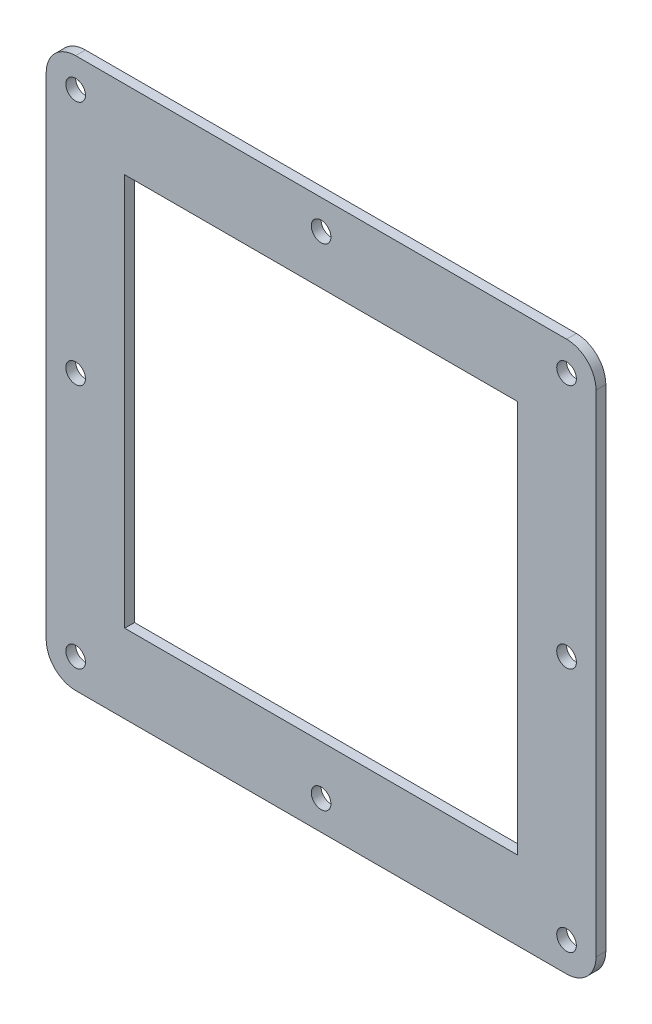
ISO-10303-21;
HEADER;
FILE_DESCRIPTION(('STEP AP214'),'2;1');
FILE_NAME('part.step','',(''),(''),'','','');
FILE_SCHEMA(('AUTOMOTIVE_DESIGN { 1 0 10303 214 1 1 1 1 }'));
ENDSEC;
DATA;
#1=APPLICATION_CONTEXT('core data for automotive mechanical design processes');
#2=APPLICATION_PROTOCOL_DEFINITION('international standard','automotive_design',2000,#1);
#3=PRODUCT_CONTEXT('',#1,'mechanical');
#4=PRODUCT('Part','Part','',(#3));
#5=PRODUCT_RELATED_PRODUCT_CATEGORY('part','',(#4));
#6=PRODUCT_DEFINITION_FORMATION('','',#4);
#7=PRODUCT_DEFINITION_CONTEXT('part definition',#1,'design');
#8=PRODUCT_DEFINITION('design','',#6,#7);
#9=PRODUCT_DEFINITION_SHAPE('','',#8);
#10=(LENGTH_UNIT() NAMED_UNIT(*) SI_UNIT(.MILLI.,.METRE.));
#11=(NAMED_UNIT(*) PLANE_ANGLE_UNIT() SI_UNIT($,.RADIAN.));
#12=(NAMED_UNIT(*) SI_UNIT($,.STERADIAN.) SOLID_ANGLE_UNIT());
#13=UNCERTAINTY_MEASURE_WITH_UNIT(LENGTH_MEASURE(1.E-05),#10,'distance_accuracy_value','');
#14=(GEOMETRIC_REPRESENTATION_CONTEXT(3) GLOBAL_UNCERTAINTY_ASSIGNED_CONTEXT((#13)) GLOBAL_UNIT_ASSIGNED_CONTEXT((#10,
#11,#12)) REPRESENTATION_CONTEXT('',''));
#15=CARTESIAN_POINT('',(0.,0.,0.));
#16=DIRECTION('',(0.,0.,1.));
#17=DIRECTION('',(1.,0.,0.));
#18=AXIS2_PLACEMENT_3D('',#15,#16,#17);
#19=CARTESIAN_POINT('',(-125.,-125.,5.));
#20=DIRECTION('',(0.,0.,1.));
#21=DIRECTION('',(1.,0.,0.));
#22=AXIS2_PLACEMENT_3D('',#19,#20,#21);
#23=PLANE('',#22);
#24=DIRECTION('',(0.,1.,0.));
#25=VECTOR('',#24,1.);
#26=CARTESIAN_POINT('',(100.,100.,5.));
#27=LINE('',#26,#25);
#28=CARTESIAN_POINT('',(100.,-100.,5.));
#29=VERTEX_POINT('',#28);
#30=CARTESIAN_POINT('',(100.,100.,5.));
#31=VERTEX_POINT('',#30);
#32=EDGE_CURVE('E48',#29,#31,#27,.T.);
#33=ORIENTED_EDGE('',*,*,#32,.F.);
#34=DIRECTION('',(1.,0.,0.));
#35=VECTOR('',#34,1.);
#36=CARTESIAN_POINT('',(-100.,-100.,5.));
#37=LINE('',#36,#35);
#38=CARTESIAN_POINT('',(-100.,-100.,5.));
#39=VERTEX_POINT('',#38);
#40=EDGE_CURVE('E140',#39,#29,#37,.T.);
#41=ORIENTED_EDGE('',*,*,#40,.F.);
#42=DIRECTION('',(0.,-1.,0.));
#43=VECTOR('',#42,1.);
#44=CARTESIAN_POINT('',(-100.,100.,5.));
#45=LINE('',#44,#43);
#46=CARTESIAN_POINT('',(-100.,100.,5.));
#47=VERTEX_POINT('',#46);
#48=EDGE_CURVE('E125',#47,#39,#45,.T.);
#49=ORIENTED_EDGE('',*,*,#48,.F.);
#50=DIRECTION('',(-1.,0.,0.));
#51=VECTOR('',#50,1.);
#52=CARTESIAN_POINT('',(-100.,100.,5.));
#53=LINE('',#52,#51);
#54=EDGE_CURVE('E134',#31,#47,#53,.T.);
#55=ORIENTED_EDGE('',*,*,#54,.F.);
#56=EDGE_LOOP('',(#33,#41,#49,#55));
#57=FACE_BOUND('',#56,.T.);
#58=CARTESIAN_POINT('',(0.,-125.,5.));
#59=DIRECTION('',(0.,0.,1.));
#60=DIRECTION('',(1.,0.,0.));
#61=AXIS2_PLACEMENT_3D('',#58,#59,#60);
#62=CIRCLE('',#61,5.);
#63=CARTESIAN_POINT('',(5.,-125.,5.));
#64=VERTEX_POINT('',#63);
#65=EDGE_CURVE('E156',#64,#64,#62,.T.);
#66=ORIENTED_EDGE('',*,*,#65,.F.);
#67=EDGE_LOOP('',(#66));
#68=FACE_BOUND('',#67,.T.);
#69=CARTESIAN_POINT('',(125.,0.,5.));
#70=DIRECTION('',(0.,0.,1.));
#71=DIRECTION('',(1.,0.,0.));
#72=AXIS2_PLACEMENT_3D('',#69,#70,#71);
#73=CIRCLE('',#72,5.00000000000001);
#74=CARTESIAN_POINT('',(130.,0.,5.));
#75=VERTEX_POINT('',#74);
#76=EDGE_CURVE('E174',#75,#75,#73,.T.);
#77=ORIENTED_EDGE('',*,*,#76,.F.);
#78=EDGE_LOOP('',(#77));
#79=FACE_BOUND('',#78,.T.);
#80=CARTESIAN_POINT('',(0.,125.,5.));
#81=DIRECTION('',(0.,0.,1.));
#82=DIRECTION('',(1.,0.,0.));
#83=AXIS2_PLACEMENT_3D('',#80,#81,#82);
#84=CIRCLE('',#83,5.);
#85=CARTESIAN_POINT('',(4.99999999999999,125.,5.));
#86=VERTEX_POINT('',#85);
#87=EDGE_CURVE('E186',#86,#86,#84,.T.);
#88=ORIENTED_EDGE('',*,*,#87,.F.);
#89=EDGE_LOOP('',(#88));
#90=FACE_BOUND('',#89,.T.);
#91=CARTESIAN_POINT('',(-125.,-125.,5.));
#92=DIRECTION('',(0.,0.,1.));
#93=DIRECTION('',(1.,0.,0.));
#94=AXIS2_PLACEMENT_3D('',#91,#92,#93);
#95=CIRCLE('',#94,15.);
#96=CARTESIAN_POINT('',(-140.,-125.,5.));
#97=VERTEX_POINT('',#96);
#98=CARTESIAN_POINT('',(-125.,-140.,5.));
#99=VERTEX_POINT('',#98);
#100=EDGE_CURVE('E198',#97,#99,#95,.T.);
#101=ORIENTED_EDGE('',*,*,#100,.T.);
#102=DIRECTION('',(1.,0.,0.));
#103=VECTOR('',#102,1.);
#104=CARTESIAN_POINT('',(-125.,-140.,5.));
#105=LINE('',#104,#103);
#106=CARTESIAN_POINT('',(125.,-140.,5.));
#107=VERTEX_POINT('',#106);
#108=EDGE_CURVE('E201',#99,#107,#105,.T.);
#109=ORIENTED_EDGE('',*,*,#108,.T.);
#110=CARTESIAN_POINT('',(125.,-125.,5.));
#111=DIRECTION('',(0.,0.,1.));
#112=DIRECTION('',(1.,0.,0.));
#113=AXIS2_PLACEMENT_3D('',#110,#111,#112);
#114=CIRCLE('',#113,15.);
#115=CARTESIAN_POINT('',(140.,-125.,5.));
#116=VERTEX_POINT('',#115);
#117=EDGE_CURVE('E204',#107,#116,#114,.T.);
#118=ORIENTED_EDGE('',*,*,#117,.T.);
#119=DIRECTION('',(0.,1.,0.));
#120=VECTOR('',#119,1.);
#121=CARTESIAN_POINT('',(140.,125.,5.));
#122=LINE('',#121,#120);
#123=CARTESIAN_POINT('',(140.,125.,5.));
#124=VERTEX_POINT('',#123);
#125=EDGE_CURVE('E206',#116,#124,#122,.T.);
#126=ORIENTED_EDGE('',*,*,#125,.T.);
#127=CARTESIAN_POINT('',(125.,125.,5.));
#128=DIRECTION('',(0.,0.,1.));
#129=DIRECTION('',(-1.,0.,0.));
#130=AXIS2_PLACEMENT_3D('',#127,#128,#129);
#131=CIRCLE('',#130,15.);
#132=CARTESIAN_POINT('',(125.,140.,5.));
#133=VERTEX_POINT('',#132);
#134=EDGE_CURVE('E208',#124,#133,#131,.T.);
#135=ORIENTED_EDGE('',*,*,#134,.T.);
#136=DIRECTION('',(-1.,0.,0.));
#137=VECTOR('',#136,1.);
#138=CARTESIAN_POINT('',(-125.,140.,5.));
#139=LINE('',#138,#137);
#140=CARTESIAN_POINT('',(-125.,140.,5.));
#141=VERTEX_POINT('',#140);
#142=EDGE_CURVE('E210',#133,#141,#139,.T.);
#143=ORIENTED_EDGE('',*,*,#142,.T.);
#144=CARTESIAN_POINT('',(-125.,125.,5.));
#145=DIRECTION('',(0.,0.,1.));
#146=DIRECTION('',(1.,0.,0.));
#147=AXIS2_PLACEMENT_3D('',#144,#145,#146);
#148=CIRCLE('',#147,15.);
#149=CARTESIAN_POINT('',(-140.,125.,5.));
#150=VERTEX_POINT('',#149);
#151=EDGE_CURVE('E212',#141,#150,#148,.T.);
#152=ORIENTED_EDGE('',*,*,#151,.T.);
#153=DIRECTION('',(0.,-1.,0.));
#154=VECTOR('',#153,1.);
#155=CARTESIAN_POINT('',(-140.,125.,5.));
#156=LINE('',#155,#154);
#157=EDGE_CURVE('E214',#150,#97,#156,.T.);
#158=ORIENTED_EDGE('',*,*,#157,.T.);
#159=EDGE_LOOP('',(#101,#109,#118,#126,#135,#143,#152,#158));
#160=FACE_BOUND('',#159,.T.);
#161=CARTESIAN_POINT('',(-125.,125.,5.));
#162=DIRECTION('',(0.,0.,1.));
#163=DIRECTION('',(1.,0.,0.));
#164=AXIS2_PLACEMENT_3D('',#161,#162,#163);
#165=CIRCLE('',#164,5.00000000000001);
#166=CARTESIAN_POINT('',(-120.,125.,5.));
#167=VERTEX_POINT('',#166);
#168=EDGE_CURVE('E192',#167,#167,#165,.T.);
#169=ORIENTED_EDGE('',*,*,#168,.F.);
#170=EDGE_LOOP('',(#169));
#171=FACE_BOUND('',#170,.T.);
#172=CARTESIAN_POINT('',(125.,125.,5.));
#173=DIRECTION('',(0.,0.,1.));
#174=DIRECTION('',(1.,0.,0.));
#175=AXIS2_PLACEMENT_3D('',#172,#173,#174);
#176=CIRCLE('',#175,4.99999999999999);
#177=CARTESIAN_POINT('',(130.,125.,5.));
#178=VERTEX_POINT('',#177);
#179=EDGE_CURVE('E180',#178,#178,#176,.T.);
#180=ORIENTED_EDGE('',*,*,#179,.F.);
#181=EDGE_LOOP('',(#180));
#182=FACE_BOUND('',#181,.T.);
#183=CARTESIAN_POINT('',(-125.,0.,5.));
#184=DIRECTION('',(0.,0.,1.));
#185=DIRECTION('',(1.,0.,0.));
#186=AXIS2_PLACEMENT_3D('',#183,#184,#185);
#187=CIRCLE('',#186,5.);
#188=CARTESIAN_POINT('',(-120.,0.,5.));
#189=VERTEX_POINT('',#188);
#190=EDGE_CURVE('E168',#189,#189,#187,.T.);
#191=ORIENTED_EDGE('',*,*,#190,.F.);
#192=EDGE_LOOP('',(#191));
#193=FACE_BOUND('',#192,.T.);
#194=CARTESIAN_POINT('',(-125.,-125.,5.));
#195=DIRECTION('',(0.,0.,1.));
#196=DIRECTION('',(1.,0.,0.));
#197=AXIS2_PLACEMENT_3D('',#194,#195,#196);
#198=CIRCLE('',#197,5.00000000000001);
#199=CARTESIAN_POINT('',(-120.,-125.,5.));
#200=VERTEX_POINT('',#199);
#201=EDGE_CURVE('E162',#200,#200,#198,.T.);
#202=ORIENTED_EDGE('',*,*,#201,.F.);
#203=EDGE_LOOP('',(#202));
#204=FACE_BOUND('',#203,.T.);
#205=CARTESIAN_POINT('',(125.,-125.,5.));
#206=DIRECTION('',(0.,0.,1.));
#207=DIRECTION('',(1.,0.,0.));
#208=AXIS2_PLACEMENT_3D('',#205,#206,#207);
#209=CIRCLE('',#208,5.00000000000002);
#210=CARTESIAN_POINT('',(130.,-125.,5.));
#211=VERTEX_POINT('',#210);
#212=EDGE_CURVE('E150',#211,#211,#209,.T.);
#213=ORIENTED_EDGE('',*,*,#212,.F.);
#214=EDGE_LOOP('',(#213));
#215=FACE_BOUND('',#214,.T.);
#216=ADVANCED_FACE('F33',(#57,#68,#79,#90,#160,#171,#182,#193,#204,#215),#23,.T.);
#217=CARTESIAN_POINT('',(-125.,-125.,0.));
#218=DIRECTION('',(0.,0.,1.));
#219=DIRECTION('',(1.,0.,0.));
#220=AXIS2_PLACEMENT_3D('',#217,#218,#219);
#221=PLANE('',#220);
#222=DIRECTION('',(1.,0.,0.));
#223=VECTOR('',#222,1.);
#224=CARTESIAN_POINT('',(-125.,-100.,0.));
#225=LINE('',#224,#223);
#226=CARTESIAN_POINT('',(-100.,-100.,0.));
#227=VERTEX_POINT('',#226);
#228=CARTESIAN_POINT('',(100.,-100.,0.));
#229=VERTEX_POINT('',#228);
#230=EDGE_CURVE('E41',#227,#229,#225,.T.);
#231=ORIENTED_EDGE('',*,*,#230,.T.);
#232=DIRECTION('',(0.,1.,0.));
#233=VECTOR('',#232,1.);
#234=CARTESIAN_POINT('',(100.,-125.,0.));
#235=LINE('',#234,#233);
#236=CARTESIAN_POINT('',(100.,100.,0.));
#237=VERTEX_POINT('',#236);
#238=EDGE_CURVE('E11',#229,#237,#235,.T.);
#239=ORIENTED_EDGE('',*,*,#238,.T.);
#240=DIRECTION('',(-1.,0.,0.));
#241=VECTOR('',#240,1.);
#242=CARTESIAN_POINT('',(-125.,100.,0.));
#243=LINE('',#242,#241);
#244=CARTESIAN_POINT('',(-100.,100.,0.));
#245=VERTEX_POINT('',#244);
#246=EDGE_CURVE('E255',#237,#245,#243,.T.);
#247=ORIENTED_EDGE('',*,*,#246,.T.);
#248=DIRECTION('',(0.,-1.,0.));
#249=VECTOR('',#248,1.);
#250=CARTESIAN_POINT('',(-100.,-125.,0.));
#251=LINE('',#250,#249);
#252=EDGE_CURVE('E128',#245,#227,#251,.T.);
#253=ORIENTED_EDGE('',*,*,#252,.T.);
#254=EDGE_LOOP('',(#231,#239,#247,#253));
#255=FACE_BOUND('',#254,.T.);
#256=CARTESIAN_POINT('',(-125.,-125.,0.));
#257=DIRECTION('',(0.,0.,1.));
#258=DIRECTION('',(1.,0.,0.));
#259=AXIS2_PLACEMENT_3D('',#256,#257,#258);
#260=CIRCLE('',#259,15.);
#261=CARTESIAN_POINT('',(-140.,-125.,0.));
#262=VERTEX_POINT('',#261);
#263=CARTESIAN_POINT('',(-125.,-140.,0.));
#264=VERTEX_POINT('',#263);
#265=EDGE_CURVE('E195',#262,#264,#260,.T.);
#266=ORIENTED_EDGE('',*,*,#265,.F.);
#267=DIRECTION('',(0.,-1.,0.));
#268=VECTOR('',#267,1.);
#269=CARTESIAN_POINT('',(-140.,125.,0.));
#270=LINE('',#269,#268);
#271=CARTESIAN_POINT('',(-140.,125.,0.));
#272=VERTEX_POINT('',#271);
#273=EDGE_CURVE('E202',#272,#262,#270,.T.);
#274=ORIENTED_EDGE('',*,*,#273,.F.);
#275=CARTESIAN_POINT('',(-125.,125.,0.));
#276=DIRECTION('',(0.,0.,1.));
#277=DIRECTION('',(1.,0.,0.));
#278=AXIS2_PLACEMENT_3D('',#275,#276,#277);
#279=CIRCLE('',#278,15.);
#280=CARTESIAN_POINT('',(-125.,140.,0.));
#281=VERTEX_POINT('',#280);
#282=EDGE_CURVE('E229',#281,#272,#279,.T.);
#283=ORIENTED_EDGE('',*,*,#282,.F.);
#284=DIRECTION('',(-1.,0.,0.));
#285=VECTOR('',#284,1.);
#286=CARTESIAN_POINT('',(-125.,140.,0.));
#287=LINE('',#286,#285);
#288=CARTESIAN_POINT('',(125.,140.,0.));
#289=VERTEX_POINT('',#288);
#290=EDGE_CURVE('E227',#289,#281,#287,.T.);
#291=ORIENTED_EDGE('',*,*,#290,.F.);
#292=CARTESIAN_POINT('',(125.,125.,0.));
#293=DIRECTION('',(0.,0.,1.));
#294=DIRECTION('',(-1.,0.,0.));
#295=AXIS2_PLACEMENT_3D('',#292,#293,#294);
#296=CIRCLE('',#295,15.);
#297=CARTESIAN_POINT('',(140.,125.,0.));
#298=VERTEX_POINT('',#297);
#299=EDGE_CURVE('E225',#298,#289,#296,.T.);
#300=ORIENTED_EDGE('',*,*,#299,.F.);
#301=DIRECTION('',(0.,1.,0.));
#302=VECTOR('',#301,1.);
#303=CARTESIAN_POINT('',(140.,125.,0.));
#304=LINE('',#303,#302);
#305=CARTESIAN_POINT('',(140.,-125.,0.));
#306=VERTEX_POINT('',#305);
#307=EDGE_CURVE('E223',#306,#298,#304,.T.);
#308=ORIENTED_EDGE('',*,*,#307,.F.);
#309=CARTESIAN_POINT('',(125.,-125.,0.));
#310=DIRECTION('',(0.,0.,1.));
#311=DIRECTION('',(1.,0.,0.));
#312=AXIS2_PLACEMENT_3D('',#309,#310,#311);
#313=CIRCLE('',#312,15.);
#314=CARTESIAN_POINT('',(125.,-140.,0.));
#315=VERTEX_POINT('',#314);
#316=EDGE_CURVE('E221',#315,#306,#313,.T.);
#317=ORIENTED_EDGE('',*,*,#316,.F.);
#318=DIRECTION('',(1.,0.,0.));
#319=VECTOR('',#318,1.);
#320=CARTESIAN_POINT('',(-125.,-140.,0.));
#321=LINE('',#320,#319);
#322=EDGE_CURVE('E219',#264,#315,#321,.T.);
#323=ORIENTED_EDGE('',*,*,#322,.F.);
#324=EDGE_LOOP('',(#266,#274,#283,#291,#300,#308,#317,#323));
#325=FACE_BOUND('',#324,.T.);
#326=CARTESIAN_POINT('',(-125.,125.,0.));
#327=DIRECTION('',(0.,0.,1.));
#328=DIRECTION('',(1.,0.,0.));
#329=AXIS2_PLACEMENT_3D('',#326,#327,#328);
#330=CIRCLE('',#329,5.00000000000001);
#331=CARTESIAN_POINT('',(-120.,125.,0.));
#332=VERTEX_POINT('',#331);
#333=EDGE_CURVE('E189',#332,#332,#330,.T.);
#334=ORIENTED_EDGE('',*,*,#333,.T.);
#335=EDGE_LOOP('',(#334));
#336=FACE_BOUND('',#335,.T.);
#337=CARTESIAN_POINT('',(0.,125.,0.));
#338=DIRECTION('',(0.,0.,1.));
#339=DIRECTION('',(1.,0.,0.));
#340=AXIS2_PLACEMENT_3D('',#337,#338,#339);
#341=CIRCLE('',#340,5.);
#342=CARTESIAN_POINT('',(4.99999999999999,125.,0.));
#343=VERTEX_POINT('',#342);
#344=EDGE_CURVE('E183',#343,#343,#341,.T.);
#345=ORIENTED_EDGE('',*,*,#344,.T.);
#346=EDGE_LOOP('',(#345));
#347=FACE_BOUND('',#346,.T.);
#348=CARTESIAN_POINT('',(125.,125.,0.));
#349=DIRECTION('',(0.,0.,1.));
#350=DIRECTION('',(1.,0.,0.));
#351=AXIS2_PLACEMENT_3D('',#348,#349,#350);
#352=CIRCLE('',#351,4.99999999999999);
#353=CARTESIAN_POINT('',(130.,125.,0.));
#354=VERTEX_POINT('',#353);
#355=EDGE_CURVE('E177',#354,#354,#352,.T.);
#356=ORIENTED_EDGE('',*,*,#355,.T.);
#357=EDGE_LOOP('',(#356));
#358=FACE_BOUND('',#357,.T.);
#359=CARTESIAN_POINT('',(125.,0.,0.));
#360=DIRECTION('',(0.,0.,1.));
#361=DIRECTION('',(1.,0.,0.));
#362=AXIS2_PLACEMENT_3D('',#359,#360,#361);
#363=CIRCLE('',#362,5.00000000000001);
#364=CARTESIAN_POINT('',(130.,0.,0.));
#365=VERTEX_POINT('',#364);
#366=EDGE_CURVE('E171',#365,#365,#363,.T.);
#367=ORIENTED_EDGE('',*,*,#366,.T.);
#368=EDGE_LOOP('',(#367));
#369=FACE_BOUND('',#368,.T.);
#370=CARTESIAN_POINT('',(-125.,0.,0.));
#371=DIRECTION('',(0.,0.,1.));
#372=DIRECTION('',(1.,0.,0.));
#373=AXIS2_PLACEMENT_3D('',#370,#371,#372);
#374=CIRCLE('',#373,5.);
#375=CARTESIAN_POINT('',(-120.,0.,0.));
#376=VERTEX_POINT('',#375);
#377=EDGE_CURVE('E165',#376,#376,#374,.T.);
#378=ORIENTED_EDGE('',*,*,#377,.T.);
#379=EDGE_LOOP('',(#378));
#380=FACE_BOUND('',#379,.T.);
#381=CARTESIAN_POINT('',(-125.,-125.,0.));
#382=DIRECTION('',(0.,0.,1.));
#383=DIRECTION('',(1.,0.,0.));
#384=AXIS2_PLACEMENT_3D('',#381,#382,#383);
#385=CIRCLE('',#384,5.00000000000001);
#386=CARTESIAN_POINT('',(-120.,-125.,0.));
#387=VERTEX_POINT('',#386);
#388=EDGE_CURVE('E159',#387,#387,#385,.T.);
#389=ORIENTED_EDGE('',*,*,#388,.T.);
#390=EDGE_LOOP('',(#389));
#391=FACE_BOUND('',#390,.T.);
#392=CARTESIAN_POINT('',(0.,-125.,0.));
#393=DIRECTION('',(0.,0.,1.));
#394=DIRECTION('',(1.,0.,0.));
#395=AXIS2_PLACEMENT_3D('',#392,#393,#394);
#396=CIRCLE('',#395,5.);
#397=CARTESIAN_POINT('',(5.,-125.,0.));
#398=VERTEX_POINT('',#397);
#399=EDGE_CURVE('E153',#398,#398,#396,.T.);
#400=ORIENTED_EDGE('',*,*,#399,.T.);
#401=EDGE_LOOP('',(#400));
#402=FACE_BOUND('',#401,.T.);
#403=CARTESIAN_POINT('',(125.,-125.,0.));
#404=DIRECTION('',(0.,0.,1.));
#405=DIRECTION('',(1.,0.,0.));
#406=AXIS2_PLACEMENT_3D('',#403,#404,#405);
#407=CIRCLE('',#406,5.00000000000002);
#408=CARTESIAN_POINT('',(130.,-125.,0.));
#409=VERTEX_POINT('',#408);
#410=EDGE_CURVE('E147',#409,#409,#407,.T.);
#411=ORIENTED_EDGE('',*,*,#410,.T.);
#412=EDGE_LOOP('',(#411));
#413=FACE_BOUND('',#412,.T.);
#414=ADVANCED_FACE('F259',(#255,#325,#336,#347,#358,#369,#380,#391,#402,#413),#221,.F.);
#415=CARTESIAN_POINT('',(-125.,-125.,5.));
#416=DIRECTION('',(0.,0.,-1.));
#417=DIRECTION('',(-1.,0.,0.));
#418=AXIS2_PLACEMENT_3D('',#415,#416,#417);
#419=CYLINDRICAL_SURFACE('',#418,15.);
#420=ORIENTED_EDGE('',*,*,#265,.T.);
#421=DIRECTION('',(0.,0.,-1.));
#422=VECTOR('',#421,1.);
#423=CARTESIAN_POINT('',(-125.,-140.,5.));
#424=LINE('',#423,#422);
#425=EDGE_CURVE('E252',#99,#264,#424,.T.);
#426=ORIENTED_EDGE('',*,*,#425,.F.);
#427=ORIENTED_EDGE('',*,*,#100,.F.);
#428=DIRECTION('',(0.,0.,-1.));
#429=VECTOR('',#428,1.);
#430=CARTESIAN_POINT('',(-140.,-125.,5.));
#431=LINE('',#430,#429);
#432=EDGE_CURVE('E216',#97,#262,#431,.T.);
#433=ORIENTED_EDGE('',*,*,#432,.T.);
#434=EDGE_LOOP('',(#420,#426,#427,#433));
#435=FACE_BOUND('',#434,.T.);
#436=ADVANCED_FACE('F35',(#435),#419,.T.);
#437=CARTESIAN_POINT('',(-125.,-140.,5.));
#438=DIRECTION('',(0.,1.,0.));
#439=DIRECTION('',(0.,0.,1.));
#440=AXIS2_PLACEMENT_3D('',#437,#438,#439);
#441=PLANE('',#440);
#442=ORIENTED_EDGE('',*,*,#322,.T.);
#443=DIRECTION('',(0.,0.,-1.));
#444=VECTOR('',#443,1.);
#445=CARTESIAN_POINT('',(125.,-140.,5.));
#446=LINE('',#445,#444);
#447=EDGE_CURVE('E249',#107,#315,#446,.T.);
#448=ORIENTED_EDGE('',*,*,#447,.F.);
#449=ORIENTED_EDGE('',*,*,#108,.F.);
#450=ORIENTED_EDGE('',*,*,#425,.T.);
#451=EDGE_LOOP('',(#442,#448,#449,#450));
#452=FACE_BOUND('',#451,.T.);
#453=ADVANCED_FACE('F309',(#452),#441,.F.);
#454=CARTESIAN_POINT('',(125.,-125.,5.));
#455=DIRECTION('',(0.,0.,-1.));
#456=DIRECTION('',(-1.,0.,0.));
#457=AXIS2_PLACEMENT_3D('',#454,#455,#456);
#458=CYLINDRICAL_SURFACE('',#457,15.);
#459=ORIENTED_EDGE('',*,*,#316,.T.);
#460=DIRECTION('',(0.,0.,-1.));
#461=VECTOR('',#460,1.);
#462=CARTESIAN_POINT('',(140.,-125.,5.));
#463=LINE('',#462,#461);
#464=EDGE_CURVE('E246',#116,#306,#463,.T.);
#465=ORIENTED_EDGE('',*,*,#464,.F.);
#466=ORIENTED_EDGE('',*,*,#117,.F.);
#467=ORIENTED_EDGE('',*,*,#447,.T.);
#468=EDGE_LOOP('',(#459,#465,#466,#467));
#469=FACE_BOUND('',#468,.T.);
#470=ADVANCED_FACE('F306',(#469),#458,.T.);
#471=CARTESIAN_POINT('',(140.,125.,5.));
#472=DIRECTION('',(-1.,0.,0.));
#473=DIRECTION('',(0.,0.,1.));
#474=AXIS2_PLACEMENT_3D('',#471,#472,#473);
#475=PLANE('',#474);
#476=ORIENTED_EDGE('',*,*,#307,.T.);
#477=DIRECTION('',(0.,0.,-1.));
#478=VECTOR('',#477,1.);
#479=CARTESIAN_POINT('',(140.,125.,5.));
#480=LINE('',#479,#478);
#481=EDGE_CURVE('E243',#124,#298,#480,.T.);
#482=ORIENTED_EDGE('',*,*,#481,.F.);
#483=ORIENTED_EDGE('',*,*,#125,.F.);
#484=ORIENTED_EDGE('',*,*,#464,.T.);
#485=EDGE_LOOP('',(#476,#482,#483,#484));
#486=FACE_BOUND('',#485,.T.);
#487=ADVANCED_FACE('F302',(#486),#475,.F.);
#488=CARTESIAN_POINT('',(125.,125.,5.));
#489=DIRECTION('',(0.,0.,-1.));
#490=DIRECTION('',(-1.,0.,0.));
#491=AXIS2_PLACEMENT_3D('',#488,#489,#490);
#492=CYLINDRICAL_SURFACE('',#491,15.);
#493=ORIENTED_EDGE('',*,*,#299,.T.);
#494=DIRECTION('',(0.,0.,-1.));
#495=VECTOR('',#494,1.);
#496=CARTESIAN_POINT('',(125.,140.,5.));
#497=LINE('',#496,#495);
#498=EDGE_CURVE('E240',#133,#289,#497,.T.);
#499=ORIENTED_EDGE('',*,*,#498,.F.);
#500=ORIENTED_EDGE('',*,*,#134,.F.);
#501=ORIENTED_EDGE('',*,*,#481,.T.);
#502=EDGE_LOOP('',(#493,#499,#500,#501));
#503=FACE_BOUND('',#502,.T.);
#504=ADVANCED_FACE('F298',(#503),#492,.T.);
#505=CARTESIAN_POINT('',(-125.,140.,5.));
#506=DIRECTION('',(0.,-1.,0.));
#507=DIRECTION('',(0.,0.,-1.));
#508=AXIS2_PLACEMENT_3D('',#505,#506,#507);
#509=PLANE('',#508);
#510=ORIENTED_EDGE('',*,*,#290,.T.);
#511=DIRECTION('',(0.,0.,-1.));
#512=VECTOR('',#511,1.);
#513=CARTESIAN_POINT('',(-125.,140.,5.));
#514=LINE('',#513,#512);
#515=EDGE_CURVE('E237',#141,#281,#514,.T.);
#516=ORIENTED_EDGE('',*,*,#515,.F.);
#517=ORIENTED_EDGE('',*,*,#142,.F.);
#518=ORIENTED_EDGE('',*,*,#498,.T.);
#519=EDGE_LOOP('',(#510,#516,#517,#518));
#520=FACE_BOUND('',#519,.T.);
#521=ADVANCED_FACE('F294',(#520),#509,.F.);
#522=CARTESIAN_POINT('',(-125.,125.,5.));
#523=DIRECTION('',(0.,0.,-1.));
#524=DIRECTION('',(-1.,0.,0.));
#525=AXIS2_PLACEMENT_3D('',#522,#523,#524);
#526=CYLINDRICAL_SURFACE('',#525,15.);
#527=ORIENTED_EDGE('',*,*,#282,.T.);
#528=DIRECTION('',(0.,0.,-1.));
#529=VECTOR('',#528,1.);
#530=CARTESIAN_POINT('',(-140.,125.,5.));
#531=LINE('',#530,#529);
#532=EDGE_CURVE('E234',#150,#272,#531,.T.);
#533=ORIENTED_EDGE('',*,*,#532,.F.);
#534=ORIENTED_EDGE('',*,*,#151,.F.);
#535=ORIENTED_EDGE('',*,*,#515,.T.);
#536=EDGE_LOOP('',(#527,#533,#534,#535));
#537=FACE_BOUND('',#536,.T.);
#538=ADVANCED_FACE('F290',(#537),#526,.T.);
#539=CARTESIAN_POINT('',(-140.,125.,5.));
#540=DIRECTION('',(1.,0.,0.));
#541=DIRECTION('',(0.,0.,-1.));
#542=AXIS2_PLACEMENT_3D('',#539,#540,#541);
#543=PLANE('',#542);
#544=ORIENTED_EDGE('',*,*,#273,.T.);
#545=ORIENTED_EDGE('',*,*,#432,.F.);
#546=ORIENTED_EDGE('',*,*,#157,.F.);
#547=ORIENTED_EDGE('',*,*,#532,.T.);
#548=EDGE_LOOP('',(#544,#545,#546,#547));
#549=FACE_BOUND('',#548,.T.);
#550=ADVANCED_FACE('F287',(#549),#543,.F.);
#551=CARTESIAN_POINT('',(-125.,125.,5.));
#552=DIRECTION('',(0.,0.,-1.));
#553=DIRECTION('',(-1.,0.,0.));
#554=AXIS2_PLACEMENT_3D('',#551,#552,#553);
#555=CYLINDRICAL_SURFACE('',#554,5.00000000000001);
#556=ORIENTED_EDGE('',*,*,#168,.T.);
#557=EDGE_LOOP('',(#556));
#558=FACE_BOUND('',#557,.T.);
#559=ORIENTED_EDGE('',*,*,#333,.F.);
#560=EDGE_LOOP('',(#559));
#561=FACE_BOUND('',#560,.T.);
#562=ADVANCED_FACE('F284',(#558,#561),#555,.F.);
#563=CARTESIAN_POINT('',(0.,125.,5.));
#564=DIRECTION('',(0.,0.,-1.));
#565=DIRECTION('',(-1.,0.,0.));
#566=AXIS2_PLACEMENT_3D('',#563,#564,#565);
#567=CYLINDRICAL_SURFACE('',#566,5.);
#568=ORIENTED_EDGE('',*,*,#87,.T.);
#569=EDGE_LOOP('',(#568));
#570=FACE_BOUND('',#569,.T.);
#571=ORIENTED_EDGE('',*,*,#344,.F.);
#572=EDGE_LOOP('',(#571));
#573=FACE_BOUND('',#572,.T.);
#574=ADVANCED_FACE('F380',(#570,#573),#567,.F.);
#575=CARTESIAN_POINT('',(125.,125.,5.));
#576=DIRECTION('',(0.,0.,-1.));
#577=DIRECTION('',(-1.,0.,0.));
#578=AXIS2_PLACEMENT_3D('',#575,#576,#577);
#579=CYLINDRICAL_SURFACE('',#578,4.99999999999999);
#580=ORIENTED_EDGE('',*,*,#179,.T.);
#581=EDGE_LOOP('',(#580));
#582=FACE_BOUND('',#581,.T.);
#583=ORIENTED_EDGE('',*,*,#355,.F.);
#584=EDGE_LOOP('',(#583));
#585=FACE_BOUND('',#584,.T.);
#586=ADVANCED_FACE('F377',(#582,#585),#579,.F.);
#587=CARTESIAN_POINT('',(125.,0.,5.));
#588=DIRECTION('',(0.,0.,-1.));
#589=DIRECTION('',(-1.,0.,0.));
#590=AXIS2_PLACEMENT_3D('',#587,#588,#589);
#591=CYLINDRICAL_SURFACE('',#590,5.00000000000001);
#592=ORIENTED_EDGE('',*,*,#76,.T.);
#593=EDGE_LOOP('',(#592));
#594=FACE_BOUND('',#593,.T.);
#595=ORIENTED_EDGE('',*,*,#366,.F.);
#596=EDGE_LOOP('',(#595));
#597=FACE_BOUND('',#596,.T.);
#598=ADVANCED_FACE('F373',(#594,#597),#591,.F.);
#599=CARTESIAN_POINT('',(-125.,0.,5.));
#600=DIRECTION('',(0.,0.,-1.));
#601=DIRECTION('',(-1.,0.,0.));
#602=AXIS2_PLACEMENT_3D('',#599,#600,#601);
#603=CYLINDRICAL_SURFACE('',#602,5.);
#604=ORIENTED_EDGE('',*,*,#190,.T.);
#605=EDGE_LOOP('',(#604));
#606=FACE_BOUND('',#605,.T.);
#607=ORIENTED_EDGE('',*,*,#377,.F.);
#608=EDGE_LOOP('',(#607));
#609=FACE_BOUND('',#608,.T.);
#610=ADVANCED_FACE('F358',(#606,#609),#603,.F.);
#611=CARTESIAN_POINT('',(-125.,-125.,5.));
#612=DIRECTION('',(0.,0.,-1.));
#613=DIRECTION('',(-1.,0.,0.));
#614=AXIS2_PLACEMENT_3D('',#611,#612,#613);
#615=CYLINDRICAL_SURFACE('',#614,5.00000000000001);
#616=ORIENTED_EDGE('',*,*,#201,.T.);
#617=EDGE_LOOP('',(#616));
#618=FACE_BOUND('',#617,.T.);
#619=ORIENTED_EDGE('',*,*,#388,.F.);
#620=EDGE_LOOP('',(#619));
#621=FACE_BOUND('',#620,.T.);
#622=ADVANCED_FACE('F355',(#618,#621),#615,.F.);
#623=CARTESIAN_POINT('',(0.,-125.,5.));
#624=DIRECTION('',(0.,0.,-1.));
#625=DIRECTION('',(-1.,0.,0.));
#626=AXIS2_PLACEMENT_3D('',#623,#624,#625);
#627=CYLINDRICAL_SURFACE('',#626,5.);
#628=ORIENTED_EDGE('',*,*,#65,.T.);
#629=EDGE_LOOP('',(#628));
#630=FACE_BOUND('',#629,.T.);
#631=ORIENTED_EDGE('',*,*,#399,.F.);
#632=EDGE_LOOP('',(#631));
#633=FACE_BOUND('',#632,.T.);
#634=ADVANCED_FACE('F273',(#630,#633),#627,.F.);
#635=CARTESIAN_POINT('',(125.,-125.,5.));
#636=DIRECTION('',(0.,0.,-1.));
#637=DIRECTION('',(-1.,0.,0.));
#638=AXIS2_PLACEMENT_3D('',#635,#636,#637);
#639=CYLINDRICAL_SURFACE('',#638,5.00000000000002);
#640=ORIENTED_EDGE('',*,*,#212,.T.);
#641=EDGE_LOOP('',(#640));
#642=FACE_BOUND('',#641,.T.);
#643=ORIENTED_EDGE('',*,*,#410,.F.);
#644=EDGE_LOOP('',(#643));
#645=FACE_BOUND('',#644,.T.);
#646=ADVANCED_FACE('F266',(#642,#645),#639,.F.);
#647=CARTESIAN_POINT('',(100.,100.,-5.));
#648=DIRECTION('',(1.,0.,0.));
#649=DIRECTION('',(0.,1.,0.));
#650=AXIS2_PLACEMENT_3D('',#647,#648,#649);
#651=PLANE('',#650);
#652=DIRECTION('',(0.,0.,1.));
#653=VECTOR('',#652,1.);
#654=CARTESIAN_POINT('',(100.,-100.,-5.));
#655=LINE('',#654,#653);
#656=EDGE_CURVE('E145',#229,#29,#655,.T.);
#657=ORIENTED_EDGE('',*,*,#656,.T.);
#658=ORIENTED_EDGE('',*,*,#32,.T.);
#659=DIRECTION('',(0.,0.,1.));
#660=VECTOR('',#659,1.);
#661=CARTESIAN_POINT('',(100.,100.,-5.));
#662=LINE('',#661,#660);
#663=EDGE_CURVE('E131',#237,#31,#662,.T.);
#664=ORIENTED_EDGE('',*,*,#663,.F.);
#665=ORIENTED_EDGE('',*,*,#238,.F.);
#666=EDGE_LOOP('',(#657,#658,#664,#665));
#667=FACE_BOUND('',#666,.T.);
#668=ADVANCED_FACE('F264',(#667),#651,.F.);
#669=CARTESIAN_POINT('',(-100.,-100.,-5.));
#670=DIRECTION('',(0.,-1.,0.));
#671=DIRECTION('',(0.,0.,-1.));
#672=AXIS2_PLACEMENT_3D('',#669,#670,#671);
#673=PLANE('',#672);
#674=DIRECTION('',(0.,0.,1.));
#675=VECTOR('',#674,1.);
#676=CARTESIAN_POINT('',(-100.,-100.,-5.));
#677=LINE('',#676,#675);
#678=EDGE_CURVE('E130',#227,#39,#677,.T.);
#679=ORIENTED_EDGE('',*,*,#678,.T.);
#680=ORIENTED_EDGE('',*,*,#40,.T.);
#681=ORIENTED_EDGE('',*,*,#656,.F.);
#682=ORIENTED_EDGE('',*,*,#230,.F.);
#683=EDGE_LOOP('',(#679,#680,#681,#682));
#684=FACE_BOUND('',#683,.T.);
#685=ADVANCED_FACE('F263',(#684),#673,.F.);
#686=CARTESIAN_POINT('',(-100.,100.,-5.));
#687=DIRECTION('',(-1.,0.,0.));
#688=DIRECTION('',(0.,-1.,0.));
#689=AXIS2_PLACEMENT_3D('',#686,#687,#688);
#690=PLANE('',#689);
#691=DIRECTION('',(0.,0.,1.));
#692=VECTOR('',#691,1.);
#693=CARTESIAN_POINT('',(-100.,100.,-5.));
#694=LINE('',#693,#692);
#695=EDGE_CURVE('E56',#245,#47,#694,.T.);
#696=ORIENTED_EDGE('',*,*,#695,.T.);
#697=ORIENTED_EDGE('',*,*,#48,.T.);
#698=ORIENTED_EDGE('',*,*,#678,.F.);
#699=ORIENTED_EDGE('',*,*,#252,.F.);
#700=EDGE_LOOP('',(#696,#697,#698,#699));
#701=FACE_BOUND('',#700,.T.);
#702=ADVANCED_FACE('F122',(#701),#690,.F.);
#703=CARTESIAN_POINT('',(-100.,100.,-5.));
#704=DIRECTION('',(0.,1.,0.));
#705=DIRECTION('',(0.,0.,1.));
#706=AXIS2_PLACEMENT_3D('',#703,#704,#705);
#707=PLANE('',#706);
#708=ORIENTED_EDGE('',*,*,#663,.T.);
#709=ORIENTED_EDGE('',*,*,#54,.T.);
#710=ORIENTED_EDGE('',*,*,#695,.F.);
#711=ORIENTED_EDGE('',*,*,#246,.F.);
#712=EDGE_LOOP('',(#708,#709,#710,#711));
#713=FACE_BOUND('',#712,.T.);
#714=ADVANCED_FACE('F135',(#713),#707,.F.);
#715=CLOSED_SHELL('',(#216,#414,#436,#453,#470,#487,#504,#521,#538,#550,#562,#574,#586,#598,
#610,#622,#634,#646,#668,#685,#702,#714));
#716=MANIFOLD_SOLID_BREP('B2',#715);
#717=ADVANCED_BREP_SHAPE_REPRESENTATION('',(#18,#716),#14);
#718=SHAPE_DEFINITION_REPRESENTATION(#9,#717);
ENDSEC;
END-ISO-10303-21;
